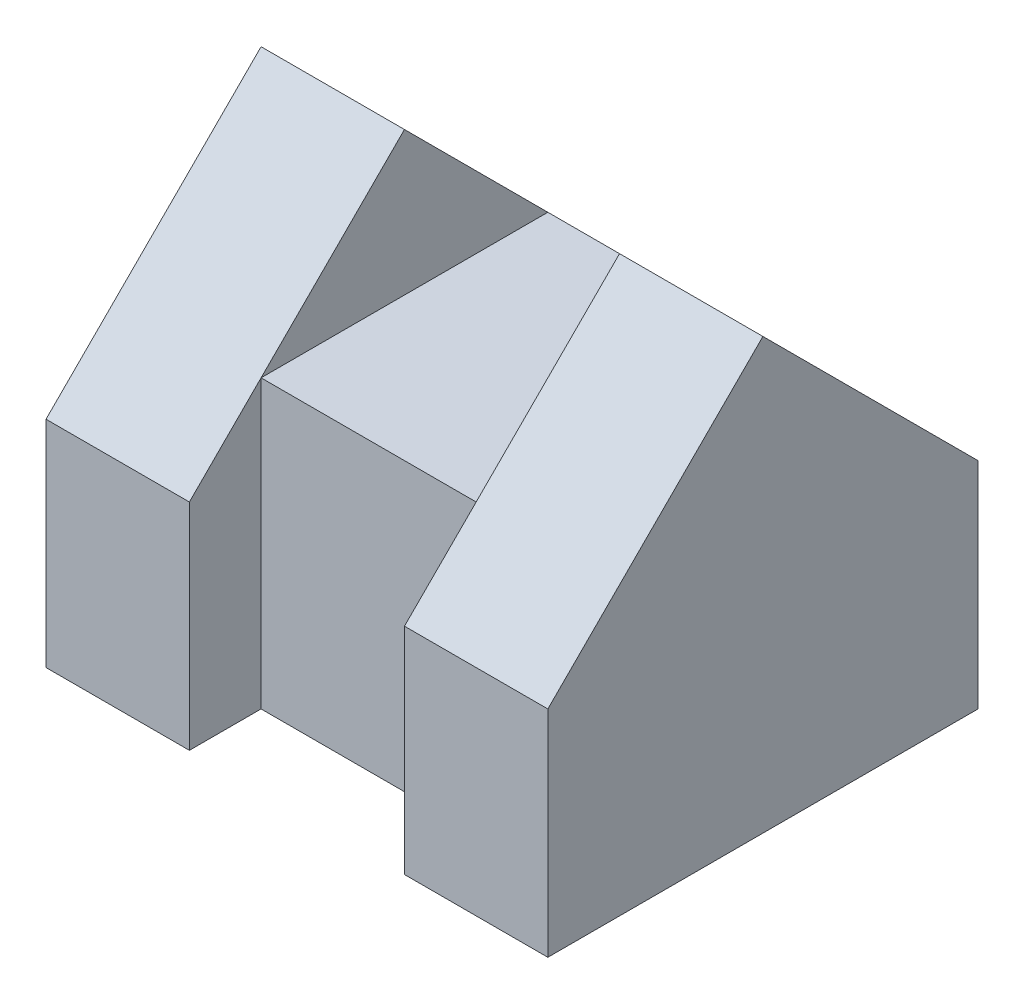
ISO-10303-21;
HEADER;
FILE_DESCRIPTION(('STEP AP214'),'2;1');
FILE_NAME('part.step','',(''),(''),'','','');
FILE_SCHEMA(('AUTOMOTIVE_DESIGN { 1 0 10303 214 1 1 1 1 }'));
ENDSEC;
DATA;
#1=APPLICATION_CONTEXT('core data for automotive mechanical design processes');
#2=APPLICATION_PROTOCOL_DEFINITION('international standard','automotive_design',2000,#1);
#3=PRODUCT_CONTEXT('',#1,'mechanical');
#4=PRODUCT('Part','Part','',(#3));
#5=PRODUCT_RELATED_PRODUCT_CATEGORY('part','',(#4));
#6=PRODUCT_DEFINITION_FORMATION('','',#4);
#7=PRODUCT_DEFINITION_CONTEXT('part definition',#1,'design');
#8=PRODUCT_DEFINITION('design','',#6,#7);
#9=PRODUCT_DEFINITION_SHAPE('','',#8);
#10=(LENGTH_UNIT() NAMED_UNIT(*) SI_UNIT(.MILLI.,.METRE.));
#11=(NAMED_UNIT(*) PLANE_ANGLE_UNIT() SI_UNIT($,.RADIAN.));
#12=(NAMED_UNIT(*) SI_UNIT($,.STERADIAN.) SOLID_ANGLE_UNIT());
#13=UNCERTAINTY_MEASURE_WITH_UNIT(LENGTH_MEASURE(1.E-05),#10,'distance_accuracy_value','');
#14=(GEOMETRIC_REPRESENTATION_CONTEXT(3) GLOBAL_UNCERTAINTY_ASSIGNED_CONTEXT((#13)) GLOBAL_UNIT_ASSIGNED_CONTEXT((#10,
#11,#12)) REPRESENTATION_CONTEXT('',''));
#15=CARTESIAN_POINT('',(0.,0.,0.));
#16=DIRECTION('',(0.,0.,1.));
#17=DIRECTION('',(1.,0.,0.));
#18=AXIS2_PLACEMENT_3D('',#15,#16,#17);
#19=CARTESIAN_POINT('',(-38.1,76.2,-76.2));
#20=DIRECTION('',(-1.,0.,0.));
#21=DIRECTION('',(0.,-1.,0.));
#22=AXIS2_PLACEMENT_3D('',#19,#20,#21);
#23=PLANE('',#22);
#24=DIRECTION('',(0.,-0.707106781186547,-0.707106781186547));
#25=VECTOR('',#24,1.);
#26=CARTESIAN_POINT('',(-38.1,38.1,-38.1));
#27=LINE('',#26,#25);
#28=CARTESIAN_POINT('',(-38.1,76.2,0.));
#29=VERTEX_POINT('',#28);
#30=CARTESIAN_POINT('',(-38.1,25.4,-50.8000000000001));
#31=VERTEX_POINT('',#30);
#32=EDGE_CURVE('E62',#29,#31,#27,.T.);
#33=ORIENTED_EDGE('',*,*,#32,.F.);
#34=DIRECTION('',(0.,-0.707106781186548,0.707106781186547));
#35=VECTOR('',#34,1.);
#36=CARTESIAN_POINT('',(-38.1,114.3,-38.1));
#37=LINE('',#36,#35);
#38=CARTESIAN_POINT('',(-38.1,25.4,50.8));
#39=VERTEX_POINT('',#38);
#40=EDGE_CURVE('E218',#29,#39,#37,.T.);
#41=ORIENTED_EDGE('',*,*,#40,.T.);
#42=DIRECTION('',(0.,0.,1.));
#43=VECTOR('',#42,1.);
#44=CARTESIAN_POINT('',(-38.1,25.4,-76.2));
#45=LINE('',#44,#43);
#46=EDGE_CURVE('E121',#31,#39,#45,.T.);
#47=ORIENTED_EDGE('',*,*,#46,.F.);
#48=EDGE_LOOP('',(#33,#41,#47));
#49=FACE_BOUND('',#48,.T.);
#50=ADVANCED_FACE('F46',(#49),#23,.F.);
#51=CARTESIAN_POINT('',(38.1,76.2,-76.2));
#52=DIRECTION('',(1.,0.,0.));
#53=DIRECTION('',(0.,1.,0.));
#54=AXIS2_PLACEMENT_3D('',#51,#52,#53);
#55=PLANE('',#54);
#56=DIRECTION('',(0.,1.,0.));
#57=VECTOR('',#56,1.);
#58=CARTESIAN_POINT('',(38.1,76.2,76.2));
#59=LINE('',#58,#57);
#60=CARTESIAN_POINT('',(38.1,-76.2,76.2));
#61=VERTEX_POINT('',#60);
#62=CARTESIAN_POINT('',(38.1,0.,76.2));
#63=VERTEX_POINT('',#62);
#64=EDGE_CURVE('E141',#61,#63,#59,.T.);
#65=ORIENTED_EDGE('',*,*,#64,.T.);
#66=DIRECTION('',(0.,0.707106781186548,-0.707106781186547));
#67=VECTOR('',#66,1.);
#68=CARTESIAN_POINT('',(38.1,114.3,-38.1));
#69=LINE('',#68,#67);
#70=CARTESIAN_POINT('',(38.1,25.4,50.8));
#71=VERTEX_POINT('',#70);
#72=EDGE_CURVE('E226',#63,#71,#69,.T.);
#73=ORIENTED_EDGE('',*,*,#72,.T.);
#74=DIRECTION('',(0.,1.,0.));
#75=VECTOR('',#74,1.);
#76=CARTESIAN_POINT('',(38.1,-76.2,50.8));
#77=LINE('',#76,#75);
#78=CARTESIAN_POINT('',(38.1,-76.2,50.8));
#79=VERTEX_POINT('',#78);
#80=EDGE_CURVE('E177',#79,#71,#77,.T.);
#81=ORIENTED_EDGE('',*,*,#80,.F.);
#82=DIRECTION('',(0.,0.,-1.));
#83=VECTOR('',#82,1.);
#84=CARTESIAN_POINT('',(38.1,-76.2,76.2));
#85=LINE('',#84,#83);
#86=EDGE_CURVE('E191',#61,#79,#85,.T.);
#87=ORIENTED_EDGE('',*,*,#86,.F.);
#88=EDGE_LOOP('',(#65,#73,#81,#87));
#89=FACE_BOUND('',#88,.T.);
#90=ADVANCED_FACE('F320',(#89),#55,.F.);
#91=CARTESIAN_POINT('',(0.,0.,-76.2));
#92=DIRECTION('',(0.,0.,-1.));
#93=DIRECTION('',(-1.,0.,0.));
#94=AXIS2_PLACEMENT_3D('',#91,#92,#93);
#95=PLANE('',#94);
#96=DIRECTION('',(0.,-1.,0.));
#97=VECTOR('',#96,1.);
#98=CARTESIAN_POINT('',(-88.9,-76.2,-76.2));
#99=LINE('',#98,#97);
#100=CARTESIAN_POINT('',(-88.9,0.,-76.2));
#101=VERTEX_POINT('',#100);
#102=CARTESIAN_POINT('',(-88.9,-76.2,-76.2));
#103=VERTEX_POINT('',#102);
#104=EDGE_CURVE('E99',#101,#103,#99,.T.);
#105=ORIENTED_EDGE('',*,*,#104,.F.);
#106=DIRECTION('',(1.,0.,0.));
#107=VECTOR('',#106,1.);
#108=CARTESIAN_POINT('',(-88.9,0.,-76.2));
#109=LINE('',#108,#107);
#110=CARTESIAN_POINT('',(-38.1,0.,-76.2));
#111=VERTEX_POINT('',#110);
#112=EDGE_CURVE('E207',#101,#111,#109,.T.);
#113=ORIENTED_EDGE('',*,*,#112,.T.);
#114=DIRECTION('',(0.,-1.,0.));
#115=VECTOR('',#114,1.);
#116=CARTESIAN_POINT('',(-38.1,76.2,-76.2));
#117=LINE('',#116,#115);
#118=CARTESIAN_POINT('',(-38.1,-76.2,-76.2000000000001));
#119=VERTEX_POINT('',#118);
#120=EDGE_CURVE('E145',#111,#119,#117,.T.);
#121=ORIENTED_EDGE('',*,*,#120,.T.);
#122=DIRECTION('',(1.,0.,0.));
#123=VECTOR('',#122,1.);
#124=CARTESIAN_POINT('',(-88.9,-76.2,-76.2));
#125=LINE('',#124,#123);
#126=EDGE_CURVE('E98',#103,#119,#125,.T.);
#127=ORIENTED_EDGE('',*,*,#126,.F.);
#128=EDGE_LOOP('',(#105,#113,#121,#127));
#129=FACE_BOUND('',#128,.T.);
#130=ADVANCED_FACE('F363',(#129),#95,.T.);
#131=CARTESIAN_POINT('',(88.9,-76.2,76.2));
#132=DIRECTION('',(-1.,0.,0.));
#133=DIRECTION('',(0.,0.,1.));
#134=AXIS2_PLACEMENT_3D('',#131,#132,#133);
#135=PLANE('',#134);
#136=DIRECTION('',(0.,0.707106781186548,0.707106781186548));
#137=VECTOR('',#136,1.);
#138=CARTESIAN_POINT('',(88.9,38.1,-38.1));
#139=LINE('',#138,#137);
#140=CARTESIAN_POINT('',(88.9,0.,-76.2));
#141=VERTEX_POINT('',#140);
#142=CARTESIAN_POINT('',(88.9,76.2,0.));
#143=VERTEX_POINT('',#142);
#144=EDGE_CURVE('E214',#141,#143,#139,.T.);
#145=ORIENTED_EDGE('',*,*,#144,.T.);
#146=DIRECTION('',(0.,0.707106781186548,-0.707106781186547));
#147=VECTOR('',#146,1.);
#148=CARTESIAN_POINT('',(88.9,38.1,38.1));
#149=LINE('',#148,#147);
#150=CARTESIAN_POINT('',(88.9,0.,76.2));
#151=VERTEX_POINT('',#150);
#152=EDGE_CURVE('E236',#151,#143,#149,.T.);
#153=ORIENTED_EDGE('',*,*,#152,.F.);
#154=DIRECTION('',(0.,1.,0.));
#155=VECTOR('',#154,1.);
#156=CARTESIAN_POINT('',(88.9,-76.2,76.2));
#157=LINE('',#156,#155);
#158=CARTESIAN_POINT('',(88.9,-76.2,76.2));
#159=VERTEX_POINT('',#158);
#160=EDGE_CURVE('E107',#159,#151,#157,.T.);
#161=ORIENTED_EDGE('',*,*,#160,.F.);
#162=DIRECTION('',(0.,0.,-1.));
#163=VECTOR('',#162,1.);
#164=CARTESIAN_POINT('',(88.9,-76.2,76.2));
#165=LINE('',#164,#163);
#166=CARTESIAN_POINT('',(88.9,-76.2,-76.2));
#167=VERTEX_POINT('',#166);
#168=EDGE_CURVE('E55',#159,#167,#165,.T.);
#169=ORIENTED_EDGE('',*,*,#168,.T.);
#170=DIRECTION('',(0.,1.,0.));
#171=VECTOR('',#170,1.);
#172=CARTESIAN_POINT('',(88.9,-76.2,-76.2));
#173=LINE('',#172,#171);
#174=EDGE_CURVE('E105',#167,#141,#173,.T.);
#175=ORIENTED_EDGE('',*,*,#174,.T.);
#176=EDGE_LOOP('',(#145,#153,#161,#169,#175));
#177=FACE_BOUND('',#176,.T.);
#178=ADVANCED_FACE('F48',(#177),#135,.F.);
#179=CARTESIAN_POINT('',(-88.9,-76.2,76.2));
#180=DIRECTION('',(1.,0.,0.));
#181=DIRECTION('',(0.,0.,-1.));
#182=AXIS2_PLACEMENT_3D('',#179,#180,#181);
#183=PLANE('',#182);
#184=DIRECTION('',(0.,-1.,0.));
#185=VECTOR('',#184,1.);
#186=CARTESIAN_POINT('',(-88.9,-76.2,76.2));
#187=LINE('',#186,#185);
#188=CARTESIAN_POINT('',(-88.9,0.,76.2));
#189=VERTEX_POINT('',#188);
#190=CARTESIAN_POINT('',(-88.9,-76.2,76.2));
#191=VERTEX_POINT('',#190);
#192=EDGE_CURVE('E131',#189,#191,#187,.T.);
#193=ORIENTED_EDGE('',*,*,#192,.F.);
#194=DIRECTION('',(0.,0.707106781186548,-0.707106781186547));
#195=VECTOR('',#194,1.);
#196=CARTESIAN_POINT('',(-88.9,38.1,38.1));
#197=LINE('',#196,#195);
#198=CARTESIAN_POINT('',(-88.9,76.2,0.));
#199=VERTEX_POINT('',#198);
#200=EDGE_CURVE('E240',#189,#199,#197,.T.);
#201=ORIENTED_EDGE('',*,*,#200,.T.);
#202=DIRECTION('',(0.,0.707106781186548,0.707106781186548));
#203=VECTOR('',#202,1.);
#204=CARTESIAN_POINT('',(-88.9,38.1,-38.1));
#205=LINE('',#204,#203);
#206=EDGE_CURVE('E217',#101,#199,#205,.T.);
#207=ORIENTED_EDGE('',*,*,#206,.F.);
#208=ORIENTED_EDGE('',*,*,#104,.T.);
#209=DIRECTION('',(0.,0.,-1.));
#210=VECTOR('',#209,1.);
#211=CARTESIAN_POINT('',(-88.9,-76.2,76.2));
#212=LINE('',#211,#210);
#213=EDGE_CURVE('E12',#191,#103,#212,.T.);
#214=ORIENTED_EDGE('',*,*,#213,.F.);
#215=EDGE_LOOP('',(#193,#201,#207,#208,#214));
#216=FACE_BOUND('',#215,.T.);
#217=ADVANCED_FACE('F348',(#216),#183,.F.);
#218=DIRECTION('',(0.,1.,0.));
#219=VECTOR('',#218,1.);
#220=CARTESIAN_POINT('',(38.1,76.2,-76.2));
#221=LINE('',#220,#219);
#222=CARTESIAN_POINT('',(38.1,-76.2,-76.2000000000001));
#223=VERTEX_POINT('',#222);
#224=CARTESIAN_POINT('',(38.1,0.,-76.2));
#225=VERTEX_POINT('',#224);
#226=EDGE_CURVE('E139',#223,#225,#221,.T.);
#227=ORIENTED_EDGE('',*,*,#226,.T.);
#228=EDGE_CURVE('E113',#225,#141,#109,.T.);
#229=ORIENTED_EDGE('',*,*,#228,.T.);
#230=ORIENTED_EDGE('',*,*,#174,.F.);
#231=EDGE_CURVE('E85',#223,#167,#125,.T.);
#232=ORIENTED_EDGE('',*,*,#231,.F.);
#233=EDGE_LOOP('',(#227,#229,#230,#232));
#234=FACE_BOUND('',#233,.T.);
#235=ADVANCED_FACE('F111',(#234),#95,.T.);
#236=DIRECTION('',(0.,1.,0.));
#237=VECTOR('',#236,1.);
#238=CARTESIAN_POINT('',(-38.1,-76.2,50.8));
#239=LINE('',#238,#237);
#240=CARTESIAN_POINT('',(-38.1,-76.2,50.8));
#241=VERTEX_POINT('',#240);
#242=EDGE_CURVE('E150',#241,#39,#239,.T.);
#243=ORIENTED_EDGE('',*,*,#242,.T.);
#244=CARTESIAN_POINT('',(-38.1,0.,76.2));
#245=VERTEX_POINT('',#244);
#246=EDGE_CURVE('E222',#39,#245,#37,.T.);
#247=ORIENTED_EDGE('',*,*,#246,.T.);
#248=DIRECTION('',(0.,-1.,0.));
#249=VECTOR('',#248,1.);
#250=CARTESIAN_POINT('',(-38.1,76.2,76.2));
#251=LINE('',#250,#249);
#252=CARTESIAN_POINT('',(-38.1,-76.2,76.2));
#253=VERTEX_POINT('',#252);
#254=EDGE_CURVE('E146',#245,#253,#251,.T.);
#255=ORIENTED_EDGE('',*,*,#254,.T.);
#256=DIRECTION('',(0.,0.,1.));
#257=VECTOR('',#256,1.);
#258=CARTESIAN_POINT('',(-38.1,-76.2,76.2));
#259=LINE('',#258,#257);
#260=EDGE_CURVE('E188',#241,#253,#259,.T.);
#261=ORIENTED_EDGE('',*,*,#260,.F.);
#262=EDGE_LOOP('',(#243,#247,#255,#261));
#263=FACE_BOUND('',#262,.T.);
#264=ADVANCED_FACE('F355',(#263),#23,.F.);
#265=EDGE_CURVE('E198',#31,#111,#27,.T.);
#266=ORIENTED_EDGE('',*,*,#265,.F.);
#267=DIRECTION('',(0.,1.,0.));
#268=VECTOR('',#267,1.);
#269=CARTESIAN_POINT('',(-38.1,-76.2,-50.8000000000001));
#270=LINE('',#269,#268);
#271=CARTESIAN_POINT('',(-38.1,-76.2,-50.8000000000001));
#272=VERTEX_POINT('',#271);
#273=EDGE_CURVE('E165',#272,#31,#270,.T.);
#274=ORIENTED_EDGE('',*,*,#273,.F.);
#275=DIRECTION('',(0.,0.,1.));
#276=VECTOR('',#275,1.);
#277=CARTESIAN_POINT('',(-38.1,-76.2,-76.2000000000001));
#278=LINE('',#277,#276);
#279=EDGE_CURVE('E156',#119,#272,#278,.T.);
#280=ORIENTED_EDGE('',*,*,#279,.F.);
#281=ORIENTED_EDGE('',*,*,#120,.F.);
#282=EDGE_LOOP('',(#266,#274,#280,#281));
#283=FACE_BOUND('',#282,.T.);
#284=ADVANCED_FACE('F303',(#283),#23,.F.);
#285=DIRECTION('',(0.,0.707106781186547,0.707106781186547));
#286=VECTOR('',#285,1.);
#287=CARTESIAN_POINT('',(38.1,38.1,-38.1));
#288=LINE('',#287,#286);
#289=CARTESIAN_POINT('',(38.1,25.4,-50.8000000000001));
#290=VERTEX_POINT('',#289);
#291=EDGE_CURVE('E201',#225,#290,#288,.T.);
#292=ORIENTED_EDGE('',*,*,#291,.F.);
#293=ORIENTED_EDGE('',*,*,#226,.F.);
#294=DIRECTION('',(0.,0.,-1.));
#295=VECTOR('',#294,1.);
#296=CARTESIAN_POINT('',(38.1,-76.2,-76.2000000000001));
#297=LINE('',#296,#295);
#298=CARTESIAN_POINT('',(38.1,-76.2,-50.8000000000001));
#299=VERTEX_POINT('',#298);
#300=EDGE_CURVE('E93',#299,#223,#297,.T.);
#301=ORIENTED_EDGE('',*,*,#300,.F.);
#302=DIRECTION('',(0.,1.,0.));
#303=VECTOR('',#302,1.);
#304=CARTESIAN_POINT('',(38.1,-76.2,-50.8000000000001));
#305=LINE('',#304,#303);
#306=EDGE_CURVE('E170',#299,#290,#305,.T.);
#307=ORIENTED_EDGE('',*,*,#306,.T.);
#308=EDGE_LOOP('',(#292,#293,#301,#307));
#309=FACE_BOUND('',#308,.T.);
#310=ADVANCED_FACE('F310',(#309),#55,.F.);
#311=DIRECTION('',(0.,0.,1.));
#312=VECTOR('',#311,1.);
#313=CARTESIAN_POINT('',(38.1,25.4,-76.2));
#314=LINE('',#313,#312);
#315=EDGE_CURVE('E115',#290,#71,#314,.T.);
#316=ORIENTED_EDGE('',*,*,#315,.T.);
#317=CARTESIAN_POINT('',(38.1,76.2,0.));
#318=VERTEX_POINT('',#317);
#319=EDGE_CURVE('E227',#71,#318,#69,.T.);
#320=ORIENTED_EDGE('',*,*,#319,.T.);
#321=EDGE_CURVE('E202',#290,#318,#288,.T.);
#322=ORIENTED_EDGE('',*,*,#321,.F.);
#323=EDGE_LOOP('',(#316,#320,#322));
#324=FACE_BOUND('',#323,.T.);
#325=ADVANCED_FACE('F332',(#324),#55,.F.);
#326=CARTESIAN_POINT('',(0.,0.,76.2));
#327=DIRECTION('',(0.,0.,-1.));
#328=DIRECTION('',(-1.,0.,0.));
#329=AXIS2_PLACEMENT_3D('',#326,#327,#328);
#330=PLANE('',#329);
#331=ORIENTED_EDGE('',*,*,#254,.F.);
#332=DIRECTION('',(1.,0.,0.));
#333=VECTOR('',#332,1.);
#334=CARTESIAN_POINT('',(-88.9,0.,76.2));
#335=LINE('',#334,#333);
#336=EDGE_CURVE('E231',#189,#245,#335,.T.);
#337=ORIENTED_EDGE('',*,*,#336,.F.);
#338=ORIENTED_EDGE('',*,*,#192,.T.);
#339=DIRECTION('',(1.,0.,0.));
#340=VECTOR('',#339,1.);
#341=CARTESIAN_POINT('',(-88.9,-76.2,76.2));
#342=LINE('',#341,#340);
#343=EDGE_CURVE('E109',#191,#253,#342,.T.);
#344=ORIENTED_EDGE('',*,*,#343,.T.);
#345=EDGE_LOOP('',(#331,#337,#338,#344));
#346=FACE_BOUND('',#345,.T.);
#347=ADVANCED_FACE('F345',(#346),#330,.F.);
#348=CARTESIAN_POINT('',(-88.9,-76.2,76.2));
#349=DIRECTION('',(0.,1.,0.));
#350=DIRECTION('',(0.,0.,1.));
#351=AXIS2_PLACEMENT_3D('',#348,#349,#350);
#352=PLANE('',#351);
#353=DIRECTION('',(-1.,0.,0.));
#354=VECTOR('',#353,1.);
#355=CARTESIAN_POINT('',(-38.1,-76.2,50.8));
#356=LINE('',#355,#354);
#357=EDGE_CURVE('E181',#79,#241,#356,.T.);
#358=ORIENTED_EDGE('',*,*,#357,.T.);
#359=ORIENTED_EDGE('',*,*,#260,.T.);
#360=ORIENTED_EDGE('',*,*,#343,.F.);
#361=ORIENTED_EDGE('',*,*,#213,.T.);
#362=ORIENTED_EDGE('',*,*,#126,.T.);
#363=ORIENTED_EDGE('',*,*,#279,.T.);
#364=DIRECTION('',(1.,0.,0.));
#365=VECTOR('',#364,1.);
#366=CARTESIAN_POINT('',(-38.1,-76.2,-50.8000000000001));
#367=LINE('',#366,#365);
#368=EDGE_CURVE('E160',#272,#299,#367,.T.);
#369=ORIENTED_EDGE('',*,*,#368,.T.);
#370=ORIENTED_EDGE('',*,*,#300,.T.);
#371=ORIENTED_EDGE('',*,*,#231,.T.);
#372=ORIENTED_EDGE('',*,*,#168,.F.);
#373=EDGE_CURVE('E71',#61,#159,#342,.T.);
#374=ORIENTED_EDGE('',*,*,#373,.F.);
#375=ORIENTED_EDGE('',*,*,#86,.T.);
#376=EDGE_LOOP('',(#358,#359,#360,#361,#362,#363,#369,#370,#371,#372,#374,#375));
#377=FACE_BOUND('',#376,.T.);
#378=ADVANCED_FACE('F88',(#377),#352,.F.);
#379=ORIENTED_EDGE('',*,*,#160,.T.);
#380=EDGE_CURVE('E235',#63,#151,#335,.T.);
#381=ORIENTED_EDGE('',*,*,#380,.F.);
#382=ORIENTED_EDGE('',*,*,#64,.F.);
#383=ORIENTED_EDGE('',*,*,#373,.T.);
#384=EDGE_LOOP('',(#379,#381,#382,#383));
#385=FACE_BOUND('',#384,.T.);
#386=ADVANCED_FACE('F397',(#385),#330,.F.);
#387=CARTESIAN_POINT('',(-38.1,25.4,-76.2));
#388=DIRECTION('',(0.,-1.,0.));
#389=DIRECTION('',(0.,0.,-1.));
#390=AXIS2_PLACEMENT_3D('',#387,#388,#389);
#391=PLANE('',#390);
#392=ORIENTED_EDGE('',*,*,#46,.T.);
#393=DIRECTION('',(-1.,0.,0.));
#394=VECTOR('',#393,1.);
#395=CARTESIAN_POINT('',(-38.1,25.4,50.8));
#396=LINE('',#395,#394);
#397=EDGE_CURVE('E169',#71,#39,#396,.T.);
#398=ORIENTED_EDGE('',*,*,#397,.F.);
#399=ORIENTED_EDGE('',*,*,#315,.F.);
#400=DIRECTION('',(1.,0.,0.));
#401=VECTOR('',#400,1.);
#402=CARTESIAN_POINT('',(-38.1,25.4,-50.8000000000001));
#403=LINE('',#402,#401);
#404=EDGE_CURVE('E159',#31,#290,#403,.T.);
#405=ORIENTED_EDGE('',*,*,#404,.F.);
#406=EDGE_LOOP('',(#392,#398,#399,#405));
#407=FACE_BOUND('',#406,.T.);
#408=ADVANCED_FACE('F329',(#407),#391,.F.);
#409=CARTESIAN_POINT('',(-38.1,-76.2,-50.8000000000001));
#410=DIRECTION('',(0.,0.,1.));
#411=DIRECTION('',(1.,0.,0.));
#412=AXIS2_PLACEMENT_3D('',#409,#410,#411);
#413=PLANE('',#412);
#414=ORIENTED_EDGE('',*,*,#404,.T.);
#415=ORIENTED_EDGE('',*,*,#306,.F.);
#416=ORIENTED_EDGE('',*,*,#368,.F.);
#417=ORIENTED_EDGE('',*,*,#273,.T.);
#418=EDGE_LOOP('',(#414,#415,#416,#417));
#419=FACE_BOUND('',#418,.T.);
#420=ADVANCED_FACE('F307',(#419),#413,.F.);
#421=CARTESIAN_POINT('',(-38.1,-76.2,50.8));
#422=DIRECTION('',(0.,0.,-1.));
#423=DIRECTION('',(-1.,0.,0.));
#424=AXIS2_PLACEMENT_3D('',#421,#422,#423);
#425=PLANE('',#424);
#426=ORIENTED_EDGE('',*,*,#397,.T.);
#427=ORIENTED_EDGE('',*,*,#242,.F.);
#428=ORIENTED_EDGE('',*,*,#357,.F.);
#429=ORIENTED_EDGE('',*,*,#80,.T.);
#430=EDGE_LOOP('',(#426,#427,#428,#429));
#431=FACE_BOUND('',#430,.T.);
#432=ADVANCED_FACE('F327',(#431),#425,.F.);
#433=CARTESIAN_POINT('',(-88.9,38.1,-38.1));
#434=DIRECTION('',(0.,0.707106781186547,-0.707106781186547));
#435=DIRECTION('',(0.,0.707106781186548,0.707106781186548));
#436=AXIS2_PLACEMENT_3D('',#433,#434,#435);
#437=PLANE('',#436);
#438=ORIENTED_EDGE('',*,*,#291,.T.);
#439=ORIENTED_EDGE('',*,*,#321,.T.);
#440=DIRECTION('',(1.,0.,0.));
#441=VECTOR('',#440,1.);
#442=CARTESIAN_POINT('',(-88.9,76.2,0.));
#443=LINE('',#442,#441);
#444=EDGE_CURVE('E211',#318,#143,#443,.T.);
#445=ORIENTED_EDGE('',*,*,#444,.T.);
#446=ORIENTED_EDGE('',*,*,#144,.F.);
#447=ORIENTED_EDGE('',*,*,#228,.F.);
#448=EDGE_LOOP('',(#438,#439,#445,#446,#447));
#449=FACE_BOUND('',#448,.T.);
#450=ADVANCED_FACE('F266',(#449),#437,.T.);
#451=ORIENTED_EDGE('',*,*,#32,.T.);
#452=ORIENTED_EDGE('',*,*,#265,.T.);
#453=ORIENTED_EDGE('',*,*,#112,.F.);
#454=ORIENTED_EDGE('',*,*,#206,.T.);
#455=EDGE_CURVE('E206',#199,#29,#443,.T.);
#456=ORIENTED_EDGE('',*,*,#455,.T.);
#457=EDGE_LOOP('',(#451,#452,#453,#454,#456));
#458=FACE_BOUND('',#457,.T.);
#459=ADVANCED_FACE('F383',(#458),#437,.T.);
#460=CARTESIAN_POINT('',(-88.9,38.1,38.1));
#461=DIRECTION('',(0.,-0.707106781186547,-0.707106781186548));
#462=DIRECTION('',(0.,0.707106781186548,-0.707106781186547));
#463=AXIS2_PLACEMENT_3D('',#460,#461,#462);
#464=PLANE('',#463);
#465=ORIENTED_EDGE('',*,*,#455,.F.);
#466=ORIENTED_EDGE('',*,*,#200,.F.);
#467=ORIENTED_EDGE('',*,*,#336,.T.);
#468=ORIENTED_EDGE('',*,*,#246,.F.);
#469=ORIENTED_EDGE('',*,*,#40,.F.);
#470=EDGE_LOOP('',(#465,#466,#467,#468,#469));
#471=FACE_BOUND('',#470,.T.);
#472=ADVANCED_FACE('F342',(#471),#464,.F.);
#473=ORIENTED_EDGE('',*,*,#380,.T.);
#474=ORIENTED_EDGE('',*,*,#152,.T.);
#475=ORIENTED_EDGE('',*,*,#444,.F.);
#476=ORIENTED_EDGE('',*,*,#319,.F.);
#477=ORIENTED_EDGE('',*,*,#72,.F.);
#478=EDGE_LOOP('',(#473,#474,#475,#476,#477));
#479=FACE_BOUND('',#478,.T.);
#480=ADVANCED_FACE('F252',(#479),#464,.F.);
#481=CLOSED_SHELL('',(#50,#90,#130,#178,#217,#235,#264,#284,#310,#325,#347,#378,#386,#408,#420,
#432,#450,#459,#472,#480));
#482=MANIFOLD_SOLID_BREP('B2',#481);
#483=ADVANCED_BREP_SHAPE_REPRESENTATION('',(#18,#482),#14);
#484=SHAPE_DEFINITION_REPRESENTATION(#9,#483);
ENDSEC;
END-ISO-10303-21;
